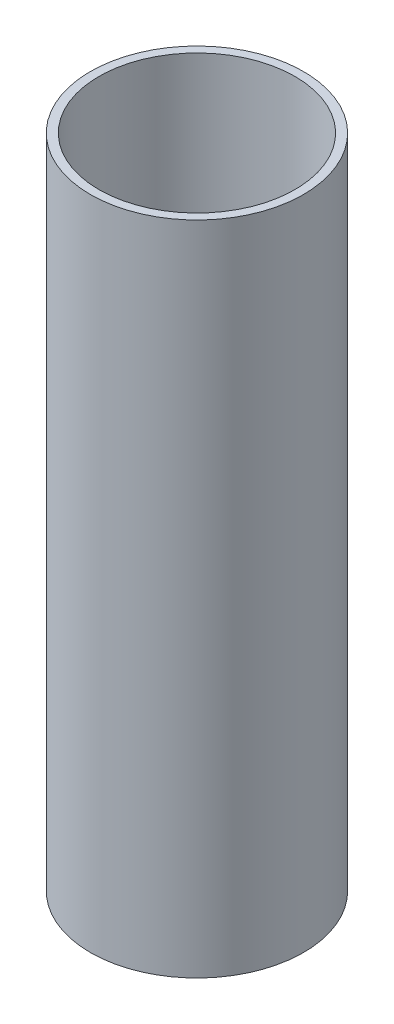
ISO-10303-21;
HEADER;
FILE_DESCRIPTION(('STEP AP214'),'2;1');
FILE_NAME('part.step','',(''),(''),'','','');
FILE_SCHEMA(('AUTOMOTIVE_DESIGN { 1 0 10303 214 1 1 1 1 }'));
ENDSEC;
DATA;
#1=APPLICATION_CONTEXT('core data for automotive mechanical design processes');
#2=APPLICATION_PROTOCOL_DEFINITION('international standard','automotive_design',2000,#1);
#3=PRODUCT_CONTEXT('',#1,'mechanical');
#4=PRODUCT('Part','Part','',(#3));
#5=PRODUCT_RELATED_PRODUCT_CATEGORY('part','',(#4));
#6=PRODUCT_DEFINITION_FORMATION('','',#4);
#7=PRODUCT_DEFINITION_CONTEXT('part definition',#1,'design');
#8=PRODUCT_DEFINITION('design','',#6,#7);
#9=PRODUCT_DEFINITION_SHAPE('','',#8);
#10=(LENGTH_UNIT() NAMED_UNIT(*) SI_UNIT(.MILLI.,.METRE.));
#11=(NAMED_UNIT(*) PLANE_ANGLE_UNIT() SI_UNIT($,.RADIAN.));
#12=(NAMED_UNIT(*) SI_UNIT($,.STERADIAN.) SOLID_ANGLE_UNIT());
#13=UNCERTAINTY_MEASURE_WITH_UNIT(LENGTH_MEASURE(1.E-05),#10,'distance_accuracy_value','');
#14=(GEOMETRIC_REPRESENTATION_CONTEXT(3) GLOBAL_UNCERTAINTY_ASSIGNED_CONTEXT((#13)) GLOBAL_UNIT_ASSIGNED_CONTEXT((#10,
#11,#12)) REPRESENTATION_CONTEXT('',''));
#15=CARTESIAN_POINT('',(0.,0.,0.));
#16=DIRECTION('',(0.,0.,1.));
#17=DIRECTION('',(1.,0.,0.));
#18=AXIS2_PLACEMENT_3D('',#15,#16,#17);
#19=CARTESIAN_POINT('',(0.,77.,0.));
#20=DIRECTION('',(0.,1.,0.));
#21=DIRECTION('',(0.,0.,1.));
#22=AXIS2_PLACEMENT_3D('',#19,#20,#21);
#23=PLANE('',#22);
#24=CARTESIAN_POINT('',(0.,77.,0.));
#25=DIRECTION('',(0.,1.,0.));
#26=DIRECTION('',(0.,0.,1.));
#27=AXIS2_PLACEMENT_3D('',#24,#25,#26);
#28=CIRCLE('',#27,12.5);
#29=CARTESIAN_POINT('',(0.,77.,12.5));
#30=VERTEX_POINT('',#29);
#31=EDGE_CURVE('E10',#30,#30,#28,.T.);
#32=ORIENTED_EDGE('',*,*,#31,.T.);
#33=EDGE_LOOP('',(#32));
#34=FACE_BOUND('',#33,.T.);
#35=CARTESIAN_POINT('',(0.,77.,0.));
#36=DIRECTION('',(0.,1.,0.));
#37=DIRECTION('',(0.,0.,1.));
#38=AXIS2_PLACEMENT_3D('',#35,#36,#37);
#39=CIRCLE('',#38,11.5);
#40=CARTESIAN_POINT('',(0.,77.,11.5));
#41=VERTEX_POINT('',#40);
#42=EDGE_CURVE('E48',#41,#41,#39,.T.);
#43=ORIENTED_EDGE('',*,*,#42,.F.);
#44=EDGE_LOOP('',(#43));
#45=FACE_BOUND('',#44,.T.);
#46=ADVANCED_FACE('F40',(#34,#45),#23,.T.);
#47=CARTESIAN_POINT('',(0.,0.,0.));
#48=DIRECTION('',(0.,1.,0.));
#49=DIRECTION('',(0.,0.,1.));
#50=AXIS2_PLACEMENT_3D('',#47,#48,#49);
#51=PLANE('',#50);
#52=CARTESIAN_POINT('',(0.,0.,0.));
#53=DIRECTION('',(0.,1.,0.));
#54=DIRECTION('',(0.,0.,1.));
#55=AXIS2_PLACEMENT_3D('',#52,#53,#54);
#56=CIRCLE('',#55,12.5);
#57=CARTESIAN_POINT('',(0.,0.,12.5));
#58=VERTEX_POINT('',#57);
#59=EDGE_CURVE('E41',#58,#58,#56,.T.);
#60=ORIENTED_EDGE('',*,*,#59,.F.);
#61=EDGE_LOOP('',(#60));
#62=FACE_BOUND('',#61,.T.);
#63=CARTESIAN_POINT('',(0.,0.,0.));
#64=DIRECTION('',(0.,1.,0.));
#65=DIRECTION('',(0.,0.,1.));
#66=AXIS2_PLACEMENT_3D('',#63,#64,#65);
#67=CIRCLE('',#66,11.5);
#68=CARTESIAN_POINT('',(0.,0.,11.5));
#69=VERTEX_POINT('',#68);
#70=EDGE_CURVE('E49',#69,#69,#67,.T.);
#71=ORIENTED_EDGE('',*,*,#70,.T.);
#72=EDGE_LOOP('',(#71));
#73=FACE_BOUND('',#72,.T.);
#74=ADVANCED_FACE('F58',(#62,#73),#51,.F.);
#75=CARTESIAN_POINT('',(0.,77.,0.));
#76=DIRECTION('',(0.,-1.,0.));
#77=DIRECTION('',(0.,0.,-1.));
#78=AXIS2_PLACEMENT_3D('',#75,#76,#77);
#79=CYLINDRICAL_SURFACE('',#78,12.5);
#80=ORIENTED_EDGE('',*,*,#31,.F.);
#81=EDGE_LOOP('',(#80));
#82=FACE_BOUND('',#81,.T.);
#83=ORIENTED_EDGE('',*,*,#59,.T.);
#84=EDGE_LOOP('',(#83));
#85=FACE_BOUND('',#84,.T.);
#86=ADVANCED_FACE('F39',(#82,#85),#79,.T.);
#87=CARTESIAN_POINT('',(0.,77.,0.));
#88=DIRECTION('',(0.,-1.,0.));
#89=DIRECTION('',(0.,0.,-1.));
#90=AXIS2_PLACEMENT_3D('',#87,#88,#89);
#91=CYLINDRICAL_SURFACE('',#90,11.5);
#92=ORIENTED_EDGE('',*,*,#42,.T.);
#93=EDGE_LOOP('',(#92));
#94=FACE_BOUND('',#93,.T.);
#95=ORIENTED_EDGE('',*,*,#70,.F.);
#96=EDGE_LOOP('',(#95));
#97=FACE_BOUND('',#96,.T.);
#98=ADVANCED_FACE('F57',(#94,#97),#91,.F.);
#99=CLOSED_SHELL('',(#46,#74,#86,#98));
#100=MANIFOLD_SOLID_BREP('B2',#99);
#101=ADVANCED_BREP_SHAPE_REPRESENTATION('',(#18,#100),#14);
#102=SHAPE_DEFINITION_REPRESENTATION(#9,#101);
ENDSEC;
END-ISO-10303-21;
